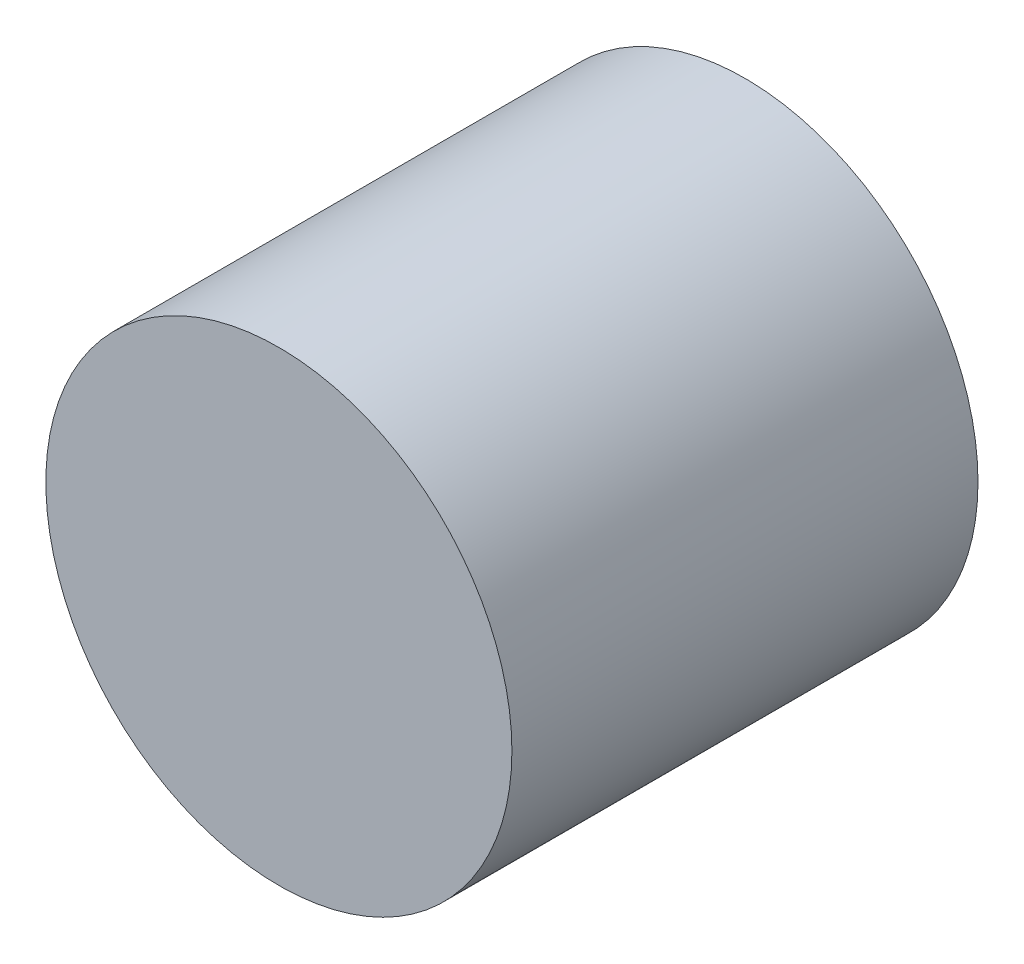
ISO-10303-21;
HEADER;
FILE_DESCRIPTION(('STEP AP214'),'2;1');
FILE_NAME('part.step','',(''),(''),'','','');
FILE_SCHEMA(('AUTOMOTIVE_DESIGN { 1 0 10303 214 1 1 1 1 }'));
ENDSEC;
DATA;
#1=APPLICATION_CONTEXT('core data for automotive mechanical design processes');
#2=APPLICATION_PROTOCOL_DEFINITION('international standard','automotive_design',2000,#1);
#3=PRODUCT_CONTEXT('',#1,'mechanical');
#4=PRODUCT('Part','Part','',(#3));
#5=PRODUCT_RELATED_PRODUCT_CATEGORY('part','',(#4));
#6=PRODUCT_DEFINITION_FORMATION('','',#4);
#7=PRODUCT_DEFINITION_CONTEXT('part definition',#1,'design');
#8=PRODUCT_DEFINITION('design','',#6,#7);
#9=PRODUCT_DEFINITION_SHAPE('','',#8);
#10=(LENGTH_UNIT() NAMED_UNIT(*) SI_UNIT(.MILLI.,.METRE.));
#11=(NAMED_UNIT(*) PLANE_ANGLE_UNIT() SI_UNIT($,.RADIAN.));
#12=(NAMED_UNIT(*) SI_UNIT($,.STERADIAN.) SOLID_ANGLE_UNIT());
#13=UNCERTAINTY_MEASURE_WITH_UNIT(LENGTH_MEASURE(1.E-05),#10,'distance_accuracy_value','');
#14=(GEOMETRIC_REPRESENTATION_CONTEXT(3) GLOBAL_UNCERTAINTY_ASSIGNED_CONTEXT((#13)) GLOBAL_UNIT_ASSIGNED_CONTEXT((#10,
#11,#12)) REPRESENTATION_CONTEXT('',''));
#15=CARTESIAN_POINT('',(0.,0.,0.));
#16=DIRECTION('',(0.,0.,1.));
#17=DIRECTION('',(1.,0.,0.));
#18=AXIS2_PLACEMENT_3D('',#15,#16,#17);
#19=CARTESIAN_POINT('',(0.,0.,0.));
#20=DIRECTION('',(0.,0.,-1.));
#21=DIRECTION('',(-1.,0.,0.));
#22=AXIS2_PLACEMENT_3D('',#19,#20,#21);
#23=PLANE('',#22);
#24=CARTESIAN_POINT('',(0.,0.,0.));
#25=DIRECTION('',(0.,0.,1.));
#26=DIRECTION('',(1.,0.,0.));
#27=AXIS2_PLACEMENT_3D('',#24,#25,#26);
#28=CIRCLE('',#27,2.);
#29=CARTESIAN_POINT('',(2.,0.,0.));
#30=VERTEX_POINT('',#29);
#31=EDGE_CURVE('E10',#30,#30,#28,.T.);
#32=ORIENTED_EDGE('',*,*,#31,.T.);
#33=EDGE_LOOP('',(#32));
#34=FACE_BOUND('',#33,.T.);
#35=ADVANCED_FACE('F41',(#34),#23,.F.);
#36=CARTESIAN_POINT('',(0.,0.,0.));
#37=DIRECTION('',(0.,0.,1.));
#38=DIRECTION('',(1.,0.,0.));
#39=AXIS2_PLACEMENT_3D('',#36,#37,#38);
#40=CYLINDRICAL_SURFACE('',#39,2.);
#41=ORIENTED_EDGE('',*,*,#31,.F.);
#42=EDGE_LOOP('',(#41));
#43=FACE_BOUND('',#42,.T.);
#44=CARTESIAN_POINT('',(0.,0.,-4.));
#45=DIRECTION('',(0.,0.,1.));
#46=DIRECTION('',(1.,0.,0.));
#47=AXIS2_PLACEMENT_3D('',#44,#45,#46);
#48=CIRCLE('',#47,2.);
#49=CARTESIAN_POINT('',(2.,0.,-4.));
#50=VERTEX_POINT('',#49);
#51=EDGE_CURVE('E47',#50,#50,#48,.T.);
#52=ORIENTED_EDGE('',*,*,#51,.T.);
#53=EDGE_LOOP('',(#52));
#54=FACE_BOUND('',#53,.T.);
#55=ADVANCED_FACE('F53',(#43,#54),#40,.T.);
#56=CARTESIAN_POINT('',(0.,2.,-4.));
#57=DIRECTION('',(0.,0.,1.));
#58=DIRECTION('',(1.,0.,0.));
#59=AXIS2_PLACEMENT_3D('',#56,#57,#58);
#60=PLANE('',#59);
#61=ORIENTED_EDGE('',*,*,#51,.F.);
#62=EDGE_LOOP('',(#61));
#63=FACE_BOUND('',#62,.T.);
#64=ADVANCED_FACE('F55',(#63),#60,.F.);
#65=CLOSED_SHELL('',(#35,#55,#64));
#66=MANIFOLD_SOLID_BREP('B2',#65);
#67=ADVANCED_BREP_SHAPE_REPRESENTATION('',(#18,#66),#14);
#68=SHAPE_DEFINITION_REPRESENTATION(#9,#67);
ENDSEC;
END-ISO-10303-21;
